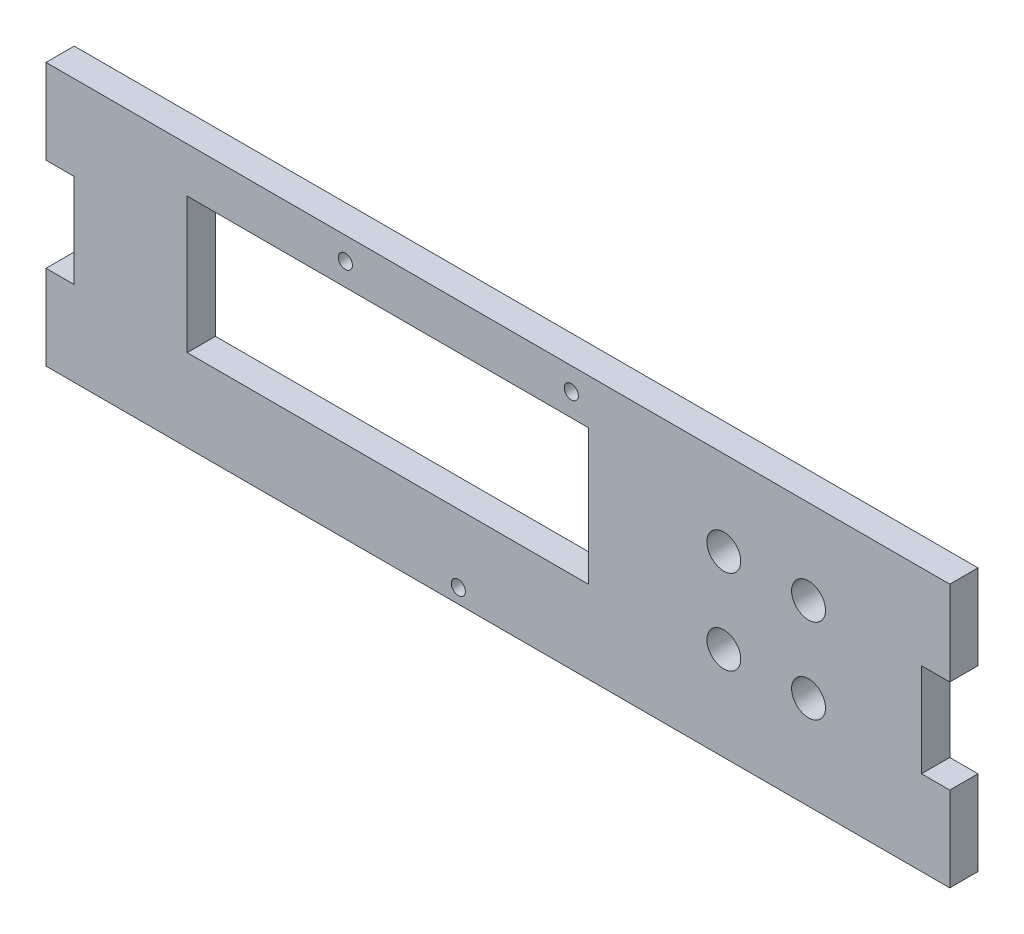
ISO-10303-21;
HEADER;
FILE_DESCRIPTION(('STEP AP214'),'2;1');
FILE_NAME('part.step','',(''),(''),'','','');
FILE_SCHEMA(('AUTOMOTIVE_DESIGN { 1 0 10303 214 1 1 1 1 }'));
ENDSEC;
DATA;
#1=APPLICATION_CONTEXT('core data for automotive mechanical design processes');
#2=APPLICATION_PROTOCOL_DEFINITION('international standard','automotive_design',2000,#1);
#3=PRODUCT_CONTEXT('',#1,'mechanical');
#4=PRODUCT('Part','Part','',(#3));
#5=PRODUCT_RELATED_PRODUCT_CATEGORY('part','',(#4));
#6=PRODUCT_DEFINITION_FORMATION('','',#4);
#7=PRODUCT_DEFINITION_CONTEXT('part definition',#1,'design');
#8=PRODUCT_DEFINITION('design','',#6,#7);
#9=PRODUCT_DEFINITION_SHAPE('','',#8);
#10=(LENGTH_UNIT() NAMED_UNIT(*) SI_UNIT(.MILLI.,.METRE.));
#11=(NAMED_UNIT(*) PLANE_ANGLE_UNIT() SI_UNIT($,.RADIAN.));
#12=(NAMED_UNIT(*) SI_UNIT($,.STERADIAN.) SOLID_ANGLE_UNIT());
#13=UNCERTAINTY_MEASURE_WITH_UNIT(LENGTH_MEASURE(1.E-05),#10,'distance_accuracy_value','');
#14=(GEOMETRIC_REPRESENTATION_CONTEXT(3) GLOBAL_UNCERTAINTY_ASSIGNED_CONTEXT((#13)) GLOBAL_UNIT_ASSIGNED_CONTEXT((#10,
#11,#12)) REPRESENTATION_CONTEXT('',''));
#15=CARTESIAN_POINT('',(0.,0.,0.));
#16=DIRECTION('',(0.,0.,1.));
#17=DIRECTION('',(1.,0.,0.));
#18=AXIS2_PLACEMENT_3D('',#15,#16,#17);
#19=CARTESIAN_POINT('',(0.,0.,5.));
#20=DIRECTION('',(0.,0.,-1.));
#21=DIRECTION('',(-1.,0.,0.));
#22=AXIS2_PLACEMENT_3D('',#19,#20,#21);
#23=PLANE('',#22);
#24=CARTESIAN_POINT('',(-6.90485909171128,-90.6512702078522,5.));
#25=DIRECTION('',(0.,0.,-1.));
#26=DIRECTION('',(-1.,0.,0.));
#27=AXIS2_PLACEMENT_3D('',#24,#25,#26);
#28=CIRCLE('',#27,1.25);
#29=CARTESIAN_POINT('',(-8.15485909171128,-90.6512702078522,5.));
#30=VERTEX_POINT('',#29);
#31=EDGE_CURVE('E183',#30,#30,#28,.F.);
#32=ORIENTED_EDGE('',*,*,#31,.F.);
#33=EDGE_LOOP('',(#32));
#34=FACE_BOUND('',#33,.T.);
#35=CARTESIAN_POINT('',(-26.9048590917113,-50.6512702078522,5.));
#36=DIRECTION('',(0.,0.,-1.));
#37=DIRECTION('',(-1.,0.,0.));
#38=AXIS2_PLACEMENT_3D('',#35,#36,#37);
#39=CIRCLE('',#38,1.25);
#40=CARTESIAN_POINT('',(-28.1548590917113,-50.6512702078522,5.));
#41=VERTEX_POINT('',#40);
#42=EDGE_CURVE('E187',#41,#41,#39,.F.);
#43=ORIENTED_EDGE('',*,*,#42,.F.);
#44=EDGE_LOOP('',(#43));
#45=FACE_BOUND('',#44,.T.);
#46=CARTESIAN_POINT('',(40.0951409082887,-61.6512702078522,5.));
#47=DIRECTION('',(0.,0.,-1.));
#48=DIRECTION('',(-1.,0.,0.));
#49=AXIS2_PLACEMENT_3D('',#46,#47,#48);
#50=CIRCLE('',#49,3.);
#51=CARTESIAN_POINT('',(37.0951409082887,-61.6512702078522,5.));
#52=VERTEX_POINT('',#51);
#53=EDGE_CURVE('E582',#52,#52,#50,.F.);
#54=ORIENTED_EDGE('',*,*,#53,.F.);
#55=EDGE_LOOP('',(#54));
#56=FACE_BOUND('',#55,.T.);
#57=CARTESIAN_POINT('',(55.0951409082887,-76.6512702078522,5.));
#58=DIRECTION('',(0.,0.,-1.));
#59=DIRECTION('',(-1.,0.,0.));
#60=AXIS2_PLACEMENT_3D('',#57,#58,#59);
#61=CIRCLE('',#60,3.);
#62=CARTESIAN_POINT('',(52.0951409082887,-76.6512702078522,5.));
#63=VERTEX_POINT('',#62);
#64=EDGE_CURVE('E578',#63,#63,#61,.F.);
#65=ORIENTED_EDGE('',*,*,#64,.F.);
#66=EDGE_LOOP('',(#65));
#67=FACE_BOUND('',#66,.T.);
#68=CARTESIAN_POINT('',(40.0951409082887,-76.6512702078522,5.));
#69=DIRECTION('',(0.,0.,-1.));
#70=DIRECTION('',(-1.,0.,0.));
#71=AXIS2_PLACEMENT_3D('',#68,#69,#70);
#72=CIRCLE('',#71,2.99999999999999);
#73=CARTESIAN_POINT('',(37.0951409082887,-76.6512702078522,5.));
#74=VERTEX_POINT('',#73);
#75=EDGE_CURVE('E574',#74,#74,#72,.F.);
#76=ORIENTED_EDGE('',*,*,#75,.F.);
#77=EDGE_LOOP('',(#76));
#78=FACE_BOUND('',#77,.T.);
#79=CARTESIAN_POINT('',(13.0951409082887,-50.6512702078522,5.));
#80=DIRECTION('',(0.,0.,-1.));
#81=DIRECTION('',(-1.,0.,0.));
#82=AXIS2_PLACEMENT_3D('',#79,#80,#81);
#83=CIRCLE('',#82,1.25);
#84=CARTESIAN_POINT('',(11.8451409082887,-50.6512702078522,5.));
#85=VERTEX_POINT('',#84);
#86=EDGE_CURVE('E570',#85,#85,#83,.F.);
#87=ORIENTED_EDGE('',*,*,#86,.F.);
#88=EDGE_LOOP('',(#87));
#89=FACE_BOUND('',#88,.T.);
#90=CARTESIAN_POINT('',(55.0951409082887,-61.6512702078522,5.));
#91=DIRECTION('',(0.,0.,-1.));
#92=DIRECTION('',(-1.,0.,0.));
#93=AXIS2_PLACEMENT_3D('',#90,#91,#92);
#94=CIRCLE('',#93,3.);
#95=CARTESIAN_POINT('',(52.0951409082887,-61.6512702078522,5.));
#96=VERTEX_POINT('',#95);
#97=EDGE_CURVE('E565',#96,#96,#94,.F.);
#98=ORIENTED_EDGE('',*,*,#97,.F.);
#99=EDGE_LOOP('',(#98));
#100=FACE_BOUND('',#99,.T.);
#101=DIRECTION('',(1.,0.,0.));
#102=VECTOR('',#101,1.);
#103=CARTESIAN_POINT('',(-79.9048590917113,-61.6512702078522,5.));
#104=LINE('',#103,#102);
#105=CARTESIAN_POINT('',(-79.9048590917113,-61.6512702078522,5.));
#106=VERTEX_POINT('',#105);
#107=CARTESIAN_POINT('',(-74.9048590917113,-61.6512702078522,5.));
#108=VERTEX_POINT('',#107);
#109=EDGE_CURVE('E215',#106,#108,#104,.T.);
#110=ORIENTED_EDGE('',*,*,#109,.T.);
#111=DIRECTION('',(0.,-1.,0.));
#112=VECTOR('',#111,1.);
#113=CARTESIAN_POINT('',(-74.9048590917113,-61.6512702078522,5.));
#114=LINE('',#113,#112);
#115=CARTESIAN_POINT('',(-74.9048590917113,-78.2212702078522,5.));
#116=VERTEX_POINT('',#115);
#117=EDGE_CURVE('E219',#108,#116,#114,.T.);
#118=ORIENTED_EDGE('',*,*,#117,.T.);
#119=DIRECTION('',(1.,0.,0.));
#120=VECTOR('',#119,1.);
#121=CARTESIAN_POINT('',(-79.9048590917113,-78.2212702078522,5.));
#122=LINE('',#121,#120);
#123=CARTESIAN_POINT('',(-79.9048590917113,-78.2212702078522,5.));
#124=VERTEX_POINT('',#123);
#125=EDGE_CURVE('E223',#124,#116,#122,.T.);
#126=ORIENTED_EDGE('',*,*,#125,.F.);
#127=DIRECTION('',(0.,-1.,0.));
#128=VECTOR('',#127,1.);
#129=CARTESIAN_POINT('',(-79.9048590917113,-78.2212702078522,5.));
#130=LINE('',#129,#128);
#131=CARTESIAN_POINT('',(-79.9048590917113,-93.2212702078522,5.));
#132=VERTEX_POINT('',#131);
#133=EDGE_CURVE('E227',#124,#132,#130,.T.);
#134=ORIENTED_EDGE('',*,*,#133,.T.);
#135=DIRECTION('',(1.,0.,0.));
#136=VECTOR('',#135,1.);
#137=CARTESIAN_POINT('',(-79.9048590917113,-93.2212702078522,5.));
#138=LINE('',#137,#136);
#139=CARTESIAN_POINT('',(80.0951409082887,-93.2212702078522,5.));
#140=VERTEX_POINT('',#139);
#141=EDGE_CURVE('E230',#132,#140,#138,.T.);
#142=ORIENTED_EDGE('',*,*,#141,.T.);
#143=DIRECTION('',(0.,1.,0.));
#144=VECTOR('',#143,1.);
#145=CARTESIAN_POINT('',(80.0951409082887,-93.2212702078522,5.));
#146=LINE('',#145,#144);
#147=CARTESIAN_POINT('',(80.0951409082887,-78.2212702078522,5.));
#148=VERTEX_POINT('',#147);
#149=EDGE_CURVE('E233',#140,#148,#146,.T.);
#150=ORIENTED_EDGE('',*,*,#149,.T.);
#151=DIRECTION('',(-1.,0.,0.));
#152=VECTOR('',#151,1.);
#153=CARTESIAN_POINT('',(80.0951409082887,-78.2212702078522,5.));
#154=LINE('',#153,#152);
#155=CARTESIAN_POINT('',(75.0951409082887,-78.2212702078522,5.));
#156=VERTEX_POINT('',#155);
#157=EDGE_CURVE('E236',#148,#156,#154,.T.);
#158=ORIENTED_EDGE('',*,*,#157,.T.);
#159=DIRECTION('',(0.,-1.,0.));
#160=VECTOR('',#159,1.);
#161=CARTESIAN_POINT('',(75.0951409082887,-61.6512702078522,5.));
#162=LINE('',#161,#160);
#163=CARTESIAN_POINT('',(75.0951409082887,-61.6512702078522,5.));
#164=VERTEX_POINT('',#163);
#165=EDGE_CURVE('E239',#164,#156,#162,.T.);
#166=ORIENTED_EDGE('',*,*,#165,.F.);
#167=DIRECTION('',(-1.,0.,0.));
#168=VECTOR('',#167,1.);
#169=CARTESIAN_POINT('',(80.0951409082887,-61.6512702078522,5.));
#170=LINE('',#169,#168);
#171=CARTESIAN_POINT('',(80.0951409082887,-61.6512702078522,5.));
#172=VERTEX_POINT('',#171);
#173=EDGE_CURVE('E243',#172,#164,#170,.T.);
#174=ORIENTED_EDGE('',*,*,#173,.F.);
#175=DIRECTION('',(0.,1.,0.));
#176=VECTOR('',#175,1.);
#177=CARTESIAN_POINT('',(80.0951409082887,-61.6512702078522,5.));
#178=LINE('',#177,#176);
#179=CARTESIAN_POINT('',(80.0951409082887,-46.6512702078522,5.));
#180=VERTEX_POINT('',#179);
#181=EDGE_CURVE('E247',#172,#180,#178,.T.);
#182=ORIENTED_EDGE('',*,*,#181,.T.);
#183=DIRECTION('',(1.,0.,0.));
#184=VECTOR('',#183,1.);
#185=CARTESIAN_POINT('',(-79.9048590917113,-46.6512702078522,5.));
#186=LINE('',#185,#184);
#187=CARTESIAN_POINT('',(-79.9048590917113,-46.6512702078522,5.));
#188=VERTEX_POINT('',#187);
#189=EDGE_CURVE('E250',#188,#180,#186,.T.);
#190=ORIENTED_EDGE('',*,*,#189,.F.);
#191=DIRECTION('',(0.,1.,0.));
#192=VECTOR('',#191,1.);
#193=CARTESIAN_POINT('',(-79.9048590917113,-61.6512702078522,5.));
#194=LINE('',#193,#192);
#195=EDGE_CURVE('E254',#106,#188,#194,.T.);
#196=ORIENTED_EDGE('',*,*,#195,.F.);
#197=EDGE_LOOP('',(#110,#118,#126,#134,#142,#150,#158,#166,#174,#182,#190,#196));
#198=FACE_BOUND('',#197,.T.);
#199=DIRECTION('',(0.,-1.,0.));
#200=VECTOR('',#199,1.);
#201=CARTESIAN_POINT('',(-54.9048590917113,0.,5.));
#202=LINE('',#201,#200);
#203=CARTESIAN_POINT('',(-54.9048590917113,-54.6512702078522,5.));
#204=VERTEX_POINT('',#203);
#205=CARTESIAN_POINT('',(-54.9048590917113,-78.6512702078522,5.));
#206=VERTEX_POINT('',#205);
#207=EDGE_CURVE('E162',#204,#206,#202,.T.);
#208=ORIENTED_EDGE('',*,*,#207,.F.);
#209=DIRECTION('',(1.,0.,0.));
#210=VECTOR('',#209,1.);
#211=CARTESIAN_POINT('',(0.,-54.6512702078522,5.));
#212=LINE('',#211,#210);
#213=CARTESIAN_POINT('',(16.0951409082887,-54.6512702078522,5.));
#214=VERTEX_POINT('',#213);
#215=EDGE_CURVE('E166',#204,#214,#212,.T.);
#216=ORIENTED_EDGE('',*,*,#215,.T.);
#217=DIRECTION('',(0.,-1.,0.));
#218=VECTOR('',#217,1.);
#219=CARTESIAN_POINT('',(16.0951409082887,0.,5.));
#220=LINE('',#219,#218);
#221=CARTESIAN_POINT('',(16.0951409082887,-78.6512702078522,5.));
#222=VERTEX_POINT('',#221);
#223=EDGE_CURVE('E205',#214,#222,#220,.T.);
#224=ORIENTED_EDGE('',*,*,#223,.T.);
#225=DIRECTION('',(1.,0.,0.));
#226=VECTOR('',#225,1.);
#227=CARTESIAN_POINT('',(0.,-78.6512702078522,5.));
#228=LINE('',#227,#226);
#229=EDGE_CURVE('E209',#206,#222,#228,.T.);
#230=ORIENTED_EDGE('',*,*,#229,.F.);
#231=EDGE_LOOP('',(#208,#216,#224,#230));
#232=FACE_BOUND('',#231,.T.);
#233=ADVANCED_FACE('F45',(#34,#45,#56,#67,#78,#89,#100,#198,#232),#23,.F.);
#234=CARTESIAN_POINT('',(0.,0.,0.));
#235=DIRECTION('',(0.,0.,-1.));
#236=DIRECTION('',(-1.,0.,0.));
#237=AXIS2_PLACEMENT_3D('',#234,#235,#236);
#238=PLANE('',#237);
#239=CARTESIAN_POINT('',(-6.90485909171128,-90.6512702078522,0.));
#240=DIRECTION('',(0.,0.,1.));
#241=DIRECTION('',(1.,0.,0.));
#242=AXIS2_PLACEMENT_3D('',#239,#240,#241);
#243=CIRCLE('',#242,1.25);
#244=CARTESIAN_POINT('',(-5.65485909171128,-90.6512702078522,0.));
#245=VERTEX_POINT('',#244);
#246=EDGE_CURVE('E551',#245,#245,#243,.T.);
#247=ORIENTED_EDGE('',*,*,#246,.T.);
#248=EDGE_LOOP('',(#247));
#249=FACE_BOUND('',#248,.T.);
#250=CARTESIAN_POINT('',(-26.9048590917113,-50.6512702078522,0.));
#251=DIRECTION('',(0.,0.,1.));
#252=DIRECTION('',(1.,0.,0.));
#253=AXIS2_PLACEMENT_3D('',#250,#251,#252);
#254=CIRCLE('',#253,1.25);
#255=CARTESIAN_POINT('',(-25.6548590917113,-50.6512702078522,0.));
#256=VERTEX_POINT('',#255);
#257=EDGE_CURVE('E553',#256,#256,#254,.T.);
#258=ORIENTED_EDGE('',*,*,#257,.T.);
#259=EDGE_LOOP('',(#258));
#260=FACE_BOUND('',#259,.T.);
#261=CARTESIAN_POINT('',(40.0951409082887,-61.6512702078522,0.));
#262=DIRECTION('',(0.,0.,1.));
#263=DIRECTION('',(1.,0.,0.));
#264=AXIS2_PLACEMENT_3D('',#261,#262,#263);
#265=CIRCLE('',#264,3.);
#266=CARTESIAN_POINT('',(43.0951409082887,-61.6512702078522,0.));
#267=VERTEX_POINT('',#266);
#268=EDGE_CURVE('E566',#267,#267,#265,.T.);
#269=ORIENTED_EDGE('',*,*,#268,.T.);
#270=EDGE_LOOP('',(#269));
#271=FACE_BOUND('',#270,.T.);
#272=CARTESIAN_POINT('',(55.0951409082887,-76.6512702078522,0.));
#273=DIRECTION('',(0.,0.,1.));
#274=DIRECTION('',(1.,0.,0.));
#275=AXIS2_PLACEMENT_3D('',#272,#273,#274);
#276=CIRCLE('',#275,3.);
#277=CARTESIAN_POINT('',(58.0951409082887,-76.6512702078522,0.));
#278=VERTEX_POINT('',#277);
#279=EDGE_CURVE('E607',#278,#278,#276,.T.);
#280=ORIENTED_EDGE('',*,*,#279,.T.);
#281=EDGE_LOOP('',(#280));
#282=FACE_BOUND('',#281,.T.);
#283=CARTESIAN_POINT('',(40.0951409082887,-76.6512702078522,0.));
#284=DIRECTION('',(0.,0.,1.));
#285=DIRECTION('',(1.,0.,0.));
#286=AXIS2_PLACEMENT_3D('',#283,#284,#285);
#287=CIRCLE('',#286,2.99999999999999);
#288=CARTESIAN_POINT('',(43.0951409082887,-76.6512702078522,0.));
#289=VERTEX_POINT('',#288);
#290=EDGE_CURVE('E611',#289,#289,#287,.T.);
#291=ORIENTED_EDGE('',*,*,#290,.T.);
#292=EDGE_LOOP('',(#291));
#293=FACE_BOUND('',#292,.T.);
#294=CARTESIAN_POINT('',(13.0951409082887,-50.6512702078522,0.));
#295=DIRECTION('',(0.,0.,1.));
#296=DIRECTION('',(1.,0.,0.));
#297=AXIS2_PLACEMENT_3D('',#294,#295,#296);
#298=CIRCLE('',#297,1.25);
#299=CARTESIAN_POINT('',(14.3451409082887,-50.6512702078522,0.));
#300=VERTEX_POINT('',#299);
#301=EDGE_CURVE('E557',#300,#300,#298,.T.);
#302=ORIENTED_EDGE('',*,*,#301,.T.);
#303=EDGE_LOOP('',(#302));
#304=FACE_BOUND('',#303,.T.);
#305=CARTESIAN_POINT('',(55.0951409082887,-61.6512702078522,0.));
#306=DIRECTION('',(0.,0.,1.));
#307=DIRECTION('',(1.,0.,0.));
#308=AXIS2_PLACEMENT_3D('',#305,#306,#307);
#309=CIRCLE('',#308,3.);
#310=CARTESIAN_POINT('',(58.0951409082887,-61.6512702078522,0.));
#311=VERTEX_POINT('',#310);
#312=EDGE_CURVE('E561',#311,#311,#309,.T.);
#313=ORIENTED_EDGE('',*,*,#312,.T.);
#314=EDGE_LOOP('',(#313));
#315=FACE_BOUND('',#314,.T.);
#316=DIRECTION('',(1.,0.,0.));
#317=VECTOR('',#316,1.);
#318=CARTESIAN_POINT('',(-79.9048590917113,-61.6512702078522,0.));
#319=LINE('',#318,#317);
#320=CARTESIAN_POINT('',(-79.9048590917113,-61.6512702078522,0.));
#321=VERTEX_POINT('',#320);
#322=CARTESIAN_POINT('',(-74.9048590917113,-61.6512702078522,0.));
#323=VERTEX_POINT('',#322);
#324=EDGE_CURVE('E214',#321,#323,#319,.T.);
#325=ORIENTED_EDGE('',*,*,#324,.F.);
#326=DIRECTION('',(0.,1.,0.));
#327=VECTOR('',#326,1.);
#328=CARTESIAN_POINT('',(-79.9048590917113,-61.6512702078522,0.));
#329=LINE('',#328,#327);
#330=CARTESIAN_POINT('',(-79.9048590917113,-46.6512702078522,0.));
#331=VERTEX_POINT('',#330);
#332=EDGE_CURVE('E220',#321,#331,#329,.T.);
#333=ORIENTED_EDGE('',*,*,#332,.T.);
#334=DIRECTION('',(1.,0.,0.));
#335=VECTOR('',#334,1.);
#336=CARTESIAN_POINT('',(-79.9048590917113,-46.6512702078522,0.));
#337=LINE('',#336,#335);
#338=CARTESIAN_POINT('',(80.0951409082887,-46.6512702078522,0.));
#339=VERTEX_POINT('',#338);
#340=EDGE_CURVE('E295',#331,#339,#337,.T.);
#341=ORIENTED_EDGE('',*,*,#340,.T.);
#342=DIRECTION('',(0.,1.,0.));
#343=VECTOR('',#342,1.);
#344=CARTESIAN_POINT('',(80.0951409082887,-61.6512702078522,0.));
#345=LINE('',#344,#343);
#346=CARTESIAN_POINT('',(80.0951409082887,-61.6512702078522,0.));
#347=VERTEX_POINT('',#346);
#348=EDGE_CURVE('E291',#347,#339,#345,.T.);
#349=ORIENTED_EDGE('',*,*,#348,.F.);
#350=DIRECTION('',(-1.,0.,0.));
#351=VECTOR('',#350,1.);
#352=CARTESIAN_POINT('',(80.0951409082887,-61.6512702078522,0.));
#353=LINE('',#352,#351);
#354=CARTESIAN_POINT('',(75.0951409082887,-61.6512702078522,0.));
#355=VERTEX_POINT('',#354);
#356=EDGE_CURVE('E287',#347,#355,#353,.T.);
#357=ORIENTED_EDGE('',*,*,#356,.T.);
#358=DIRECTION('',(0.,-1.,0.));
#359=VECTOR('',#358,1.);
#360=CARTESIAN_POINT('',(75.0951409082887,-61.6512702078522,0.));
#361=LINE('',#360,#359);
#362=CARTESIAN_POINT('',(75.0951409082887,-78.2212702078522,0.));
#363=VERTEX_POINT('',#362);
#364=EDGE_CURVE('E283',#355,#363,#361,.T.);
#365=ORIENTED_EDGE('',*,*,#364,.T.);
#366=DIRECTION('',(-1.,0.,0.));
#367=VECTOR('',#366,1.);
#368=CARTESIAN_POINT('',(80.0951409082887,-78.2212702078522,0.));
#369=LINE('',#368,#367);
#370=CARTESIAN_POINT('',(80.0951409082887,-78.2212702078522,0.));
#371=VERTEX_POINT('',#370);
#372=EDGE_CURVE('E279',#371,#363,#369,.T.);
#373=ORIENTED_EDGE('',*,*,#372,.F.);
#374=DIRECTION('',(0.,1.,0.));
#375=VECTOR('',#374,1.);
#376=CARTESIAN_POINT('',(80.0951409082887,-93.2212702078522,0.));
#377=LINE('',#376,#375);
#378=CARTESIAN_POINT('',(80.0951409082887,-93.2212702078522,0.));
#379=VERTEX_POINT('',#378);
#380=EDGE_CURVE('E276',#379,#371,#377,.T.);
#381=ORIENTED_EDGE('',*,*,#380,.F.);
#382=DIRECTION('',(1.,0.,0.));
#383=VECTOR('',#382,1.);
#384=CARTESIAN_POINT('',(-79.9048590917113,-93.2212702078522,0.));
#385=LINE('',#384,#383);
#386=CARTESIAN_POINT('',(-79.9048590917113,-93.2212702078522,0.));
#387=VERTEX_POINT('',#386);
#388=EDGE_CURVE('E273',#387,#379,#385,.T.);
#389=ORIENTED_EDGE('',*,*,#388,.F.);
#390=DIRECTION('',(0.,-1.,0.));
#391=VECTOR('',#390,1.);
#392=CARTESIAN_POINT('',(-79.9048590917113,-78.2212702078522,0.));
#393=LINE('',#392,#391);
#394=CARTESIAN_POINT('',(-79.9048590917113,-78.2212702078522,0.));
#395=VERTEX_POINT('',#394);
#396=EDGE_CURVE('E270',#395,#387,#393,.T.);
#397=ORIENTED_EDGE('',*,*,#396,.F.);
#398=DIRECTION('',(1.,0.,0.));
#399=VECTOR('',#398,1.);
#400=CARTESIAN_POINT('',(-79.9048590917113,-78.2212702078522,0.));
#401=LINE('',#400,#399);
#402=CARTESIAN_POINT('',(-74.9048590917113,-78.2212702078522,0.));
#403=VERTEX_POINT('',#402);
#404=EDGE_CURVE('E266',#395,#403,#401,.T.);
#405=ORIENTED_EDGE('',*,*,#404,.T.);
#406=DIRECTION('',(0.,-1.,0.));
#407=VECTOR('',#406,1.);
#408=CARTESIAN_POINT('',(-74.9048590917113,-61.6512702078522,0.));
#409=LINE('',#408,#407);
#410=EDGE_CURVE('E262',#323,#403,#409,.T.);
#411=ORIENTED_EDGE('',*,*,#410,.F.);
#412=EDGE_LOOP('',(#325,#333,#341,#349,#357,#365,#373,#381,#389,#397,#405,#411));
#413=FACE_BOUND('',#412,.T.);
#414=DIRECTION('',(1.,0.,0.));
#415=VECTOR('',#414,1.);
#416=CARTESIAN_POINT('',(-54.9048590917113,-54.6512702078522,0.));
#417=LINE('',#416,#415);
#418=CARTESIAN_POINT('',(-54.9048590917113,-54.6512702078522,0.));
#419=VERTEX_POINT('',#418);
#420=CARTESIAN_POINT('',(16.0951409082887,-54.6512702078522,0.));
#421=VERTEX_POINT('',#420);
#422=EDGE_CURVE('E181',#419,#421,#417,.T.);
#423=ORIENTED_EDGE('',*,*,#422,.F.);
#424=DIRECTION('',(0.,-1.,0.));
#425=VECTOR('',#424,1.);
#426=CARTESIAN_POINT('',(-54.9048590917113,-54.6512702078522,0.));
#427=LINE('',#426,#425);
#428=CARTESIAN_POINT('',(-54.9048590917113,-78.6512702078522,0.));
#429=VERTEX_POINT('',#428);
#430=EDGE_CURVE('E69',#419,#429,#427,.T.);
#431=ORIENTED_EDGE('',*,*,#430,.T.);
#432=DIRECTION('',(1.,0.,0.));
#433=VECTOR('',#432,1.);
#434=CARTESIAN_POINT('',(-54.9048590917113,-78.6512702078522,0.));
#435=LINE('',#434,#433);
#436=CARTESIAN_POINT('',(16.0951409082887,-78.6512702078522,0.));
#437=VERTEX_POINT('',#436);
#438=EDGE_CURVE('E170',#429,#437,#435,.T.);
#439=ORIENTED_EDGE('',*,*,#438,.T.);
#440=DIRECTION('',(0.,-1.,0.));
#441=VECTOR('',#440,1.);
#442=CARTESIAN_POINT('',(16.0951409082887,-54.6512702078522,0.));
#443=LINE('',#442,#441);
#444=EDGE_CURVE('E177',#421,#437,#443,.T.);
#445=ORIENTED_EDGE('',*,*,#444,.F.);
#446=EDGE_LOOP('',(#423,#431,#439,#445));
#447=FACE_BOUND('',#446,.T.);
#448=ADVANCED_FACE('F180',(#249,#260,#271,#282,#293,#304,#315,#413,#447),#238,.T.);
#449=CARTESIAN_POINT('',(-79.9048590917113,-61.6512702078522,5.));
#450=DIRECTION('',(0.,1.,0.));
#451=DIRECTION('',(0.,0.,1.));
#452=AXIS2_PLACEMENT_3D('',#449,#450,#451);
#453=PLANE('',#452);
#454=ORIENTED_EDGE('',*,*,#324,.T.);
#455=DIRECTION('',(0.,0.,-1.));
#456=VECTOR('',#455,1.);
#457=CARTESIAN_POINT('',(-74.9048590917113,-61.6512702078522,5.));
#458=LINE('',#457,#456);
#459=EDGE_CURVE('E11',#108,#323,#458,.T.);
#460=ORIENTED_EDGE('',*,*,#459,.F.);
#461=ORIENTED_EDGE('',*,*,#109,.F.);
#462=DIRECTION('',(0.,0.,-1.));
#463=VECTOR('',#462,1.);
#464=CARTESIAN_POINT('',(-79.9048590917113,-61.6512702078522,5.));
#465=LINE('',#464,#463);
#466=EDGE_CURVE('E258',#106,#321,#465,.T.);
#467=ORIENTED_EDGE('',*,*,#466,.T.);
#468=EDGE_LOOP('',(#454,#460,#461,#467));
#469=FACE_BOUND('',#468,.T.);
#470=ADVANCED_FACE('F47',(#469),#453,.F.);
#471=CARTESIAN_POINT('',(-74.9048590917113,-61.6512702078522,5.));
#472=DIRECTION('',(1.,0.,0.));
#473=DIRECTION('',(0.,0.,-1.));
#474=AXIS2_PLACEMENT_3D('',#471,#472,#473);
#475=PLANE('',#474);
#476=ORIENTED_EDGE('',*,*,#410,.T.);
#477=DIRECTION('',(0.,0.,-1.));
#478=VECTOR('',#477,1.);
#479=CARTESIAN_POINT('',(-74.9048590917113,-78.2212702078522,5.));
#480=LINE('',#479,#478);
#481=EDGE_CURVE('E54',#116,#403,#480,.T.);
#482=ORIENTED_EDGE('',*,*,#481,.F.);
#483=ORIENTED_EDGE('',*,*,#117,.F.);
#484=ORIENTED_EDGE('',*,*,#459,.T.);
#485=EDGE_LOOP('',(#476,#482,#483,#484));
#486=FACE_BOUND('',#485,.T.);
#487=ADVANCED_FACE('F340',(#486),#475,.F.);
#488=CARTESIAN_POINT('',(-79.9048590917113,-78.2212702078522,5.));
#489=DIRECTION('',(0.,1.,0.));
#490=DIRECTION('',(0.,0.,1.));
#491=AXIS2_PLACEMENT_3D('',#488,#489,#490);
#492=PLANE('',#491);
#493=ORIENTED_EDGE('',*,*,#404,.F.);
#494=DIRECTION('',(0.,0.,-1.));
#495=VECTOR('',#494,1.);
#496=CARTESIAN_POINT('',(-79.9048590917113,-78.2212702078522,5.));
#497=LINE('',#496,#495);
#498=EDGE_CURVE('E331',#124,#395,#497,.T.);
#499=ORIENTED_EDGE('',*,*,#498,.F.);
#500=ORIENTED_EDGE('',*,*,#125,.T.);
#501=ORIENTED_EDGE('',*,*,#481,.T.);
#502=EDGE_LOOP('',(#493,#499,#500,#501));
#503=FACE_BOUND('',#502,.T.);
#504=ADVANCED_FACE('F337',(#503),#492,.T.);
#505=CARTESIAN_POINT('',(-79.9048590917113,-78.2212702078522,5.));
#506=DIRECTION('',(1.,0.,0.));
#507=DIRECTION('',(0.,0.,-1.));
#508=AXIS2_PLACEMENT_3D('',#505,#506,#507);
#509=PLANE('',#508);
#510=ORIENTED_EDGE('',*,*,#396,.T.);
#511=DIRECTION('',(0.,0.,-1.));
#512=VECTOR('',#511,1.);
#513=CARTESIAN_POINT('',(-79.9048590917113,-93.2212702078522,5.));
#514=LINE('',#513,#512);
#515=EDGE_CURVE('E327',#132,#387,#514,.T.);
#516=ORIENTED_EDGE('',*,*,#515,.F.);
#517=ORIENTED_EDGE('',*,*,#133,.F.);
#518=ORIENTED_EDGE('',*,*,#498,.T.);
#519=EDGE_LOOP('',(#510,#516,#517,#518));
#520=FACE_BOUND('',#519,.T.);
#521=ADVANCED_FACE('F349',(#520),#509,.F.);
#522=CARTESIAN_POINT('',(-79.9048590917113,-93.2212702078522,5.));
#523=DIRECTION('',(0.,1.,0.));
#524=DIRECTION('',(0.,0.,1.));
#525=AXIS2_PLACEMENT_3D('',#522,#523,#524);
#526=PLANE('',#525);
#527=ORIENTED_EDGE('',*,*,#388,.T.);
#528=DIRECTION('',(0.,0.,-1.));
#529=VECTOR('',#528,1.);
#530=CARTESIAN_POINT('',(80.0951409082887,-93.2212702078522,5.));
#531=LINE('',#530,#529);
#532=EDGE_CURVE('E323',#140,#379,#531,.T.);
#533=ORIENTED_EDGE('',*,*,#532,.F.);
#534=ORIENTED_EDGE('',*,*,#141,.F.);
#535=ORIENTED_EDGE('',*,*,#515,.T.);
#536=EDGE_LOOP('',(#527,#533,#534,#535));
#537=FACE_BOUND('',#536,.T.);
#538=ADVANCED_FACE('F353',(#537),#526,.F.);
#539=CARTESIAN_POINT('',(80.0951409082887,-93.2212702078522,5.));
#540=DIRECTION('',(-1.,0.,0.));
#541=DIRECTION('',(0.,0.,1.));
#542=AXIS2_PLACEMENT_3D('',#539,#540,#541);
#543=PLANE('',#542);
#544=ORIENTED_EDGE('',*,*,#380,.T.);
#545=DIRECTION('',(0.,0.,-1.));
#546=VECTOR('',#545,1.);
#547=CARTESIAN_POINT('',(80.0951409082887,-78.2212702078522,5.));
#548=LINE('',#547,#546);
#549=EDGE_CURVE('E319',#148,#371,#548,.T.);
#550=ORIENTED_EDGE('',*,*,#549,.F.);
#551=ORIENTED_EDGE('',*,*,#149,.F.);
#552=ORIENTED_EDGE('',*,*,#532,.T.);
#553=EDGE_LOOP('',(#544,#550,#551,#552));
#554=FACE_BOUND('',#553,.T.);
#555=ADVANCED_FACE('F387',(#554),#543,.F.);
#556=CARTESIAN_POINT('',(80.0951409082887,-78.2212702078522,5.));
#557=DIRECTION('',(0.,-1.,0.));
#558=DIRECTION('',(0.,0.,-1.));
#559=AXIS2_PLACEMENT_3D('',#556,#557,#558);
#560=PLANE('',#559);
#561=ORIENTED_EDGE('',*,*,#372,.T.);
#562=DIRECTION('',(0.,0.,-1.));
#563=VECTOR('',#562,1.);
#564=CARTESIAN_POINT('',(75.0951409082887,-78.2212702078522,5.));
#565=LINE('',#564,#563);
#566=EDGE_CURVE('E316',#156,#363,#565,.T.);
#567=ORIENTED_EDGE('',*,*,#566,.F.);
#568=ORIENTED_EDGE('',*,*,#157,.F.);
#569=ORIENTED_EDGE('',*,*,#549,.T.);
#570=EDGE_LOOP('',(#561,#567,#568,#569));
#571=FACE_BOUND('',#570,.T.);
#572=ADVANCED_FACE('F384',(#571),#560,.F.);
#573=CARTESIAN_POINT('',(75.0951409082887,-61.6512702078522,5.));
#574=DIRECTION('',(1.,0.,0.));
#575=DIRECTION('',(0.,1.,0.));
#576=AXIS2_PLACEMENT_3D('',#573,#574,#575);
#577=PLANE('',#576);
#578=ORIENTED_EDGE('',*,*,#364,.F.);
#579=DIRECTION('',(0.,0.,-1.));
#580=VECTOR('',#579,1.);
#581=CARTESIAN_POINT('',(75.0951409082887,-61.6512702078522,5.));
#582=LINE('',#581,#580);
#583=EDGE_CURVE('E313',#164,#355,#582,.T.);
#584=ORIENTED_EDGE('',*,*,#583,.F.);
#585=ORIENTED_EDGE('',*,*,#165,.T.);
#586=ORIENTED_EDGE('',*,*,#566,.T.);
#587=EDGE_LOOP('',(#578,#584,#585,#586));
#588=FACE_BOUND('',#587,.T.);
#589=ADVANCED_FACE('F380',(#588),#577,.T.);
#590=CARTESIAN_POINT('',(80.0951409082887,-61.6512702078522,5.));
#591=DIRECTION('',(0.,-1.,0.));
#592=DIRECTION('',(0.,0.,-1.));
#593=AXIS2_PLACEMENT_3D('',#590,#591,#592);
#594=PLANE('',#593);
#595=ORIENTED_EDGE('',*,*,#356,.F.);
#596=DIRECTION('',(0.,0.,-1.));
#597=VECTOR('',#596,1.);
#598=CARTESIAN_POINT('',(80.0951409082887,-61.6512702078522,5.));
#599=LINE('',#598,#597);
#600=EDGE_CURVE('E310',#172,#347,#599,.T.);
#601=ORIENTED_EDGE('',*,*,#600,.F.);
#602=ORIENTED_EDGE('',*,*,#173,.T.);
#603=ORIENTED_EDGE('',*,*,#583,.T.);
#604=EDGE_LOOP('',(#595,#601,#602,#603));
#605=FACE_BOUND('',#604,.T.);
#606=ADVANCED_FACE('F374',(#605),#594,.T.);
#607=CARTESIAN_POINT('',(80.0951409082887,-61.6512702078522,5.));
#608=DIRECTION('',(-1.,0.,0.));
#609=DIRECTION('',(0.,0.,1.));
#610=AXIS2_PLACEMENT_3D('',#607,#608,#609);
#611=PLANE('',#610);
#612=ORIENTED_EDGE('',*,*,#348,.T.);
#613=DIRECTION('',(0.,0.,-1.));
#614=VECTOR('',#613,1.);
#615=CARTESIAN_POINT('',(80.0951409082887,-46.6512702078522,5.));
#616=LINE('',#615,#614);
#617=EDGE_CURVE('E307',#180,#339,#616,.T.);
#618=ORIENTED_EDGE('',*,*,#617,.F.);
#619=ORIENTED_EDGE('',*,*,#181,.F.);
#620=ORIENTED_EDGE('',*,*,#600,.T.);
#621=EDGE_LOOP('',(#612,#618,#619,#620));
#622=FACE_BOUND('',#621,.T.);
#623=ADVANCED_FACE('F414',(#622),#611,.F.);
#624=CARTESIAN_POINT('',(-79.9048590917113,-46.6512702078522,5.));
#625=DIRECTION('',(0.,1.,0.));
#626=DIRECTION('',(0.,0.,1.));
#627=AXIS2_PLACEMENT_3D('',#624,#625,#626);
#628=PLANE('',#627);
#629=ORIENTED_EDGE('',*,*,#340,.F.);
#630=DIRECTION('',(0.,0.,-1.));
#631=VECTOR('',#630,1.);
#632=CARTESIAN_POINT('',(-79.9048590917113,-46.6512702078522,5.));
#633=LINE('',#632,#631);
#634=EDGE_CURVE('E304',#188,#331,#633,.T.);
#635=ORIENTED_EDGE('',*,*,#634,.F.);
#636=ORIENTED_EDGE('',*,*,#189,.T.);
#637=ORIENTED_EDGE('',*,*,#617,.T.);
#638=EDGE_LOOP('',(#629,#635,#636,#637));
#639=FACE_BOUND('',#638,.T.);
#640=ADVANCED_FACE('F368',(#639),#628,.T.);
#641=CARTESIAN_POINT('',(-79.9048590917113,-61.6512702078522,5.));
#642=DIRECTION('',(-1.,0.,0.));
#643=DIRECTION('',(0.,0.,1.));
#644=AXIS2_PLACEMENT_3D('',#641,#642,#643);
#645=PLANE('',#644);
#646=ORIENTED_EDGE('',*,*,#332,.F.);
#647=ORIENTED_EDGE('',*,*,#466,.F.);
#648=ORIENTED_EDGE('',*,*,#195,.T.);
#649=ORIENTED_EDGE('',*,*,#634,.T.);
#650=EDGE_LOOP('',(#646,#647,#648,#649));
#651=FACE_BOUND('',#650,.T.);
#652=ADVANCED_FACE('F365',(#651),#645,.T.);
#653=CARTESIAN_POINT('',(-54.9048590917113,-54.6512702078522,7.));
#654=DIRECTION('',(1.,0.,0.));
#655=DIRECTION('',(0.,0.,-1.));
#656=AXIS2_PLACEMENT_3D('',#653,#654,#655);
#657=PLANE('',#656);
#658=ORIENTED_EDGE('',*,*,#207,.T.);
#659=DIRECTION('',(0.,0.,-1.));
#660=VECTOR('',#659,1.);
#661=CARTESIAN_POINT('',(-54.9048590917113,-78.6512702078522,7.));
#662=LINE('',#661,#660);
#663=EDGE_CURVE('E158',#206,#429,#662,.T.);
#664=ORIENTED_EDGE('',*,*,#663,.T.);
#665=ORIENTED_EDGE('',*,*,#430,.F.);
#666=DIRECTION('',(0.,0.,-1.));
#667=VECTOR('',#666,1.);
#668=CARTESIAN_POINT('',(-54.9048590917113,-54.6512702078522,7.));
#669=LINE('',#668,#667);
#670=EDGE_CURVE('E195',#204,#419,#669,.T.);
#671=ORIENTED_EDGE('',*,*,#670,.F.);
#672=EDGE_LOOP('',(#658,#664,#665,#671));
#673=FACE_BOUND('',#672,.T.);
#674=ADVANCED_FACE('F160',(#673),#657,.T.);
#675=CARTESIAN_POINT('',(-54.9048590917113,-78.6512702078522,7.));
#676=DIRECTION('',(0.,1.,0.));
#677=DIRECTION('',(0.,0.,1.));
#678=AXIS2_PLACEMENT_3D('',#675,#676,#677);
#679=PLANE('',#678);
#680=ORIENTED_EDGE('',*,*,#229,.T.);
#681=DIRECTION('',(0.,0.,-1.));
#682=VECTOR('',#681,1.);
#683=CARTESIAN_POINT('',(16.0951409082887,-78.6512702078522,7.));
#684=LINE('',#683,#682);
#685=EDGE_CURVE('E167',#222,#437,#684,.T.);
#686=ORIENTED_EDGE('',*,*,#685,.T.);
#687=ORIENTED_EDGE('',*,*,#438,.F.);
#688=ORIENTED_EDGE('',*,*,#663,.F.);
#689=EDGE_LOOP('',(#680,#686,#687,#688));
#690=FACE_BOUND('',#689,.T.);
#691=ADVANCED_FACE('F171',(#690),#679,.T.);
#692=CARTESIAN_POINT('',(16.0951409082887,-54.6512702078522,7.));
#693=DIRECTION('',(1.,0.,0.));
#694=DIRECTION('',(0.,1.,0.));
#695=AXIS2_PLACEMENT_3D('',#692,#693,#694);
#696=PLANE('',#695);
#697=DIRECTION('',(0.,0.,-1.));
#698=VECTOR('',#697,1.);
#699=CARTESIAN_POINT('',(16.0951409082887,-54.6512702078522,7.));
#700=LINE('',#699,#698);
#701=EDGE_CURVE('E61',#214,#421,#700,.T.);
#702=ORIENTED_EDGE('',*,*,#701,.T.);
#703=ORIENTED_EDGE('',*,*,#444,.T.);
#704=ORIENTED_EDGE('',*,*,#685,.F.);
#705=ORIENTED_EDGE('',*,*,#223,.F.);
#706=EDGE_LOOP('',(#702,#703,#704,#705));
#707=FACE_BOUND('',#706,.T.);
#708=ADVANCED_FACE('F459',(#707),#696,.F.);
#709=CARTESIAN_POINT('',(-54.9048590917113,-54.6512702078522,7.));
#710=DIRECTION('',(0.,1.,0.));
#711=DIRECTION('',(0.,0.,1.));
#712=AXIS2_PLACEMENT_3D('',#709,#710,#711);
#713=PLANE('',#712);
#714=ORIENTED_EDGE('',*,*,#670,.T.);
#715=ORIENTED_EDGE('',*,*,#422,.T.);
#716=ORIENTED_EDGE('',*,*,#701,.F.);
#717=ORIENTED_EDGE('',*,*,#215,.F.);
#718=EDGE_LOOP('',(#714,#715,#716,#717));
#719=FACE_BOUND('',#718,.T.);
#720=ADVANCED_FACE('F465',(#719),#713,.F.);
#721=CARTESIAN_POINT('',(55.0951409082887,-61.6512702078522,10.));
#722=DIRECTION('',(0.,0.,-1.));
#723=DIRECTION('',(-1.,0.,0.));
#724=AXIS2_PLACEMENT_3D('',#721,#722,#723);
#725=CYLINDRICAL_SURFACE('',#724,3.);
#726=ORIENTED_EDGE('',*,*,#312,.F.);
#727=EDGE_LOOP('',(#726));
#728=FACE_BOUND('',#727,.T.);
#729=ORIENTED_EDGE('',*,*,#97,.T.);
#730=EDGE_LOOP('',(#729));
#731=FACE_BOUND('',#730,.T.);
#732=ADVANCED_FACE('F473',(#728,#731),#725,.F.);
#733=CARTESIAN_POINT('',(13.0951409082887,-50.6512702078522,10.));
#734=DIRECTION('',(0.,0.,-1.));
#735=DIRECTION('',(-1.,0.,0.));
#736=AXIS2_PLACEMENT_3D('',#733,#734,#735);
#737=CYLINDRICAL_SURFACE('',#736,1.25);
#738=ORIENTED_EDGE('',*,*,#301,.F.);
#739=EDGE_LOOP('',(#738));
#740=FACE_BOUND('',#739,.T.);
#741=ORIENTED_EDGE('',*,*,#86,.T.);
#742=EDGE_LOOP('',(#741));
#743=FACE_BOUND('',#742,.T.);
#744=ADVANCED_FACE('F485',(#740,#743),#737,.F.);
#745=CARTESIAN_POINT('',(40.0951409082887,-76.6512702078522,10.));
#746=DIRECTION('',(0.,0.,-1.));
#747=DIRECTION('',(-1.,0.,0.));
#748=AXIS2_PLACEMENT_3D('',#745,#746,#747);
#749=CYLINDRICAL_SURFACE('',#748,2.99999999999999);
#750=ORIENTED_EDGE('',*,*,#290,.F.);
#751=EDGE_LOOP('',(#750));
#752=FACE_BOUND('',#751,.T.);
#753=ORIENTED_EDGE('',*,*,#75,.T.);
#754=EDGE_LOOP('',(#753));
#755=FACE_BOUND('',#754,.T.);
#756=ADVANCED_FACE('F495',(#752,#755),#749,.F.);
#757=CARTESIAN_POINT('',(55.0951409082887,-76.6512702078522,10.));
#758=DIRECTION('',(0.,0.,-1.));
#759=DIRECTION('',(-1.,0.,0.));
#760=AXIS2_PLACEMENT_3D('',#757,#758,#759);
#761=CYLINDRICAL_SURFACE('',#760,3.);
#762=ORIENTED_EDGE('',*,*,#279,.F.);
#763=EDGE_LOOP('',(#762));
#764=FACE_BOUND('',#763,.T.);
#765=ORIENTED_EDGE('',*,*,#64,.T.);
#766=EDGE_LOOP('',(#765));
#767=FACE_BOUND('',#766,.T.);
#768=ADVANCED_FACE('F505',(#764,#767),#761,.F.);
#769=CARTESIAN_POINT('',(40.0951409082887,-61.6512702078522,10.));
#770=DIRECTION('',(0.,0.,-1.));
#771=DIRECTION('',(-1.,0.,0.));
#772=AXIS2_PLACEMENT_3D('',#769,#770,#771);
#773=CYLINDRICAL_SURFACE('',#772,3.);
#774=ORIENTED_EDGE('',*,*,#268,.F.);
#775=EDGE_LOOP('',(#774));
#776=FACE_BOUND('',#775,.T.);
#777=ORIENTED_EDGE('',*,*,#53,.T.);
#778=EDGE_LOOP('',(#777));
#779=FACE_BOUND('',#778,.T.);
#780=ADVANCED_FACE('F515',(#776,#779),#773,.F.);
#781=CARTESIAN_POINT('',(-26.9048590917113,-50.6512702078522,10.));
#782=DIRECTION('',(0.,0.,-1.));
#783=DIRECTION('',(-1.,0.,0.));
#784=AXIS2_PLACEMENT_3D('',#781,#782,#783);
#785=CYLINDRICAL_SURFACE('',#784,1.25);
#786=ORIENTED_EDGE('',*,*,#257,.F.);
#787=EDGE_LOOP('',(#786));
#788=FACE_BOUND('',#787,.T.);
#789=ORIENTED_EDGE('',*,*,#42,.T.);
#790=EDGE_LOOP('',(#789));
#791=FACE_BOUND('',#790,.T.);
#792=ADVANCED_FACE('F525',(#788,#791),#785,.F.);
#793=CARTESIAN_POINT('',(-6.90485909171128,-90.6512702078522,10.));
#794=DIRECTION('',(0.,0.,-1.));
#795=DIRECTION('',(-1.,0.,0.));
#796=AXIS2_PLACEMENT_3D('',#793,#794,#795);
#797=CYLINDRICAL_SURFACE('',#796,1.25);
#798=ORIENTED_EDGE('',*,*,#246,.F.);
#799=EDGE_LOOP('',(#798));
#800=FACE_BOUND('',#799,.T.);
#801=ORIENTED_EDGE('',*,*,#31,.T.);
#802=EDGE_LOOP('',(#801));
#803=FACE_BOUND('',#802,.T.);
#804=ADVANCED_FACE('F535',(#800,#803),#797,.F.);
#805=CLOSED_SHELL('',(#233,#448,#470,#487,#504,#521,#538,#555,#572,#589,#606,#623,#640,#652,
#674,#691,#708,#720,#732,#744,#756,#768,#780,#792,#804));
#806=MANIFOLD_SOLID_BREP('B2',#805);
#807=ADVANCED_BREP_SHAPE_REPRESENTATION('',(#18,#806),#14);
#808=SHAPE_DEFINITION_REPRESENTATION(#9,#807);
ENDSEC;
END-ISO-10303-21;
